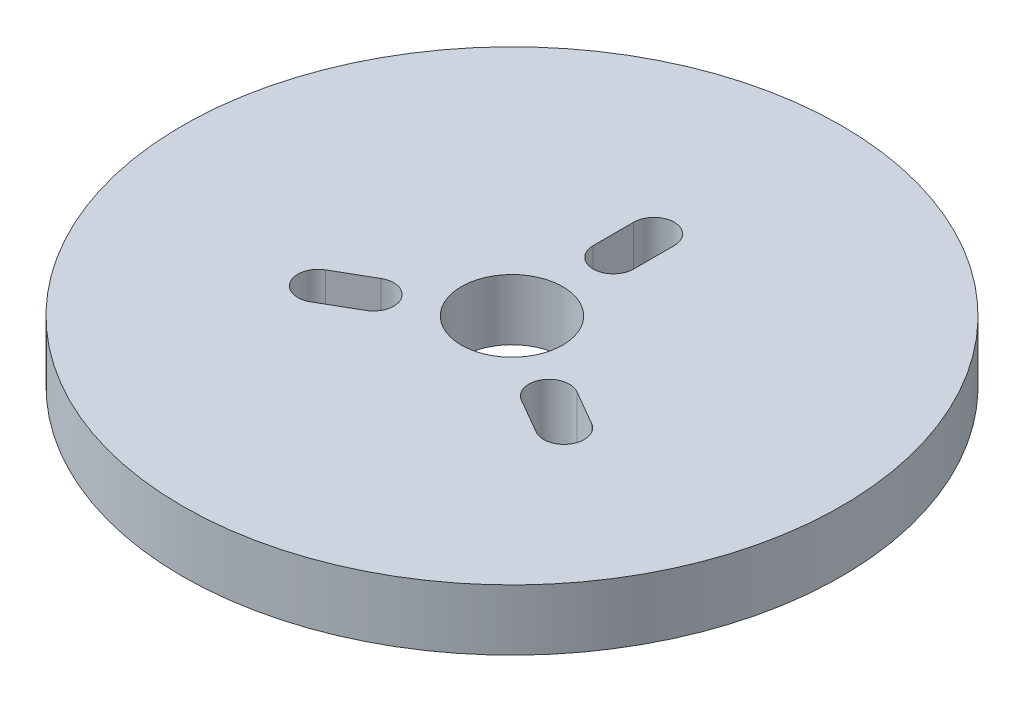
ISO-10303-21;
HEADER;
FILE_DESCRIPTION(('STEP AP214'),'2;1');
FILE_NAME('part.step','',(''),(''),'','','');
FILE_SCHEMA(('AUTOMOTIVE_DESIGN { 1 0 10303 214 1 1 1 1 }'));
ENDSEC;
DATA;
#1=APPLICATION_CONTEXT('core data for automotive mechanical design processes');
#2=APPLICATION_PROTOCOL_DEFINITION('international standard','automotive_design',2000,#1);
#3=PRODUCT_CONTEXT('',#1,'mechanical');
#4=PRODUCT('Part','Part','',(#3));
#5=PRODUCT_RELATED_PRODUCT_CATEGORY('part','',(#4));
#6=PRODUCT_DEFINITION_FORMATION('','',#4);
#7=PRODUCT_DEFINITION_CONTEXT('part definition',#1,'design');
#8=PRODUCT_DEFINITION('design','',#6,#7);
#9=PRODUCT_DEFINITION_SHAPE('','',#8);
#10=(LENGTH_UNIT() NAMED_UNIT(*) SI_UNIT(.MILLI.,.METRE.));
#11=(NAMED_UNIT(*) PLANE_ANGLE_UNIT() SI_UNIT($,.RADIAN.));
#12=(NAMED_UNIT(*) SI_UNIT($,.STERADIAN.) SOLID_ANGLE_UNIT());
#13=UNCERTAINTY_MEASURE_WITH_UNIT(LENGTH_MEASURE(1.E-05),#10,'distance_accuracy_value','');
#14=(GEOMETRIC_REPRESENTATION_CONTEXT(3) GLOBAL_UNCERTAINTY_ASSIGNED_CONTEXT((#13)) GLOBAL_UNIT_ASSIGNED_CONTEXT((#10,
#11,#12)) REPRESENTATION_CONTEXT('',''));
#15=CARTESIAN_POINT('',(0.,0.,0.));
#16=DIRECTION('',(0.,0.,1.));
#17=DIRECTION('',(1.,0.,0.));
#18=AXIS2_PLACEMENT_3D('',#15,#16,#17);
#19=CARTESIAN_POINT('',(0.,6.,0.));
#20=DIRECTION('',(0.,1.,0.));
#21=DIRECTION('',(0.,0.,1.));
#22=AXIS2_PLACEMENT_3D('',#19,#20,#21);
#23=PLANE('',#22);
#24=CARTESIAN_POINT('',(0.,6.,0.));
#25=DIRECTION('',(0.,1.,0.));
#26=DIRECTION('',(0.,0.,1.));
#27=AXIS2_PLACEMENT_3D('',#24,#25,#26);
#28=CIRCLE('',#27,32.5);
#29=CARTESIAN_POINT('',(0.,6.,32.5));
#30=VERTEX_POINT('',#29);
#31=EDGE_CURVE('E11',#30,#30,#28,.T.);
#32=ORIENTED_EDGE('',*,*,#31,.T.);
#33=EDGE_LOOP('',(#32));
#34=FACE_BOUND('',#33,.T.);
#35=CARTESIAN_POINT('',(0.,6.,0.));
#36=DIRECTION('',(0.,1.,0.));
#37=DIRECTION('',(0.,0.,1.));
#38=AXIS2_PLACEMENT_3D('',#35,#36,#37);
#39=CIRCLE('',#38,5.);
#40=CARTESIAN_POINT('',(0.,6.,5.));
#41=VERTEX_POINT('',#40);
#42=EDGE_CURVE('E222',#41,#41,#39,.T.);
#43=ORIENTED_EDGE('',*,*,#42,.F.);
#44=EDGE_LOOP('',(#43));
#45=FACE_BOUND('',#44,.T.);
#46=DIRECTION('',(0.,0.,-1.));
#47=VECTOR('',#46,1.);
#48=CARTESIAN_POINT('',(2.,6.,-10.));
#49=LINE('',#48,#47);
#50=CARTESIAN_POINT('',(2.,6.,-10.));
#51=VERTEX_POINT('',#50);
#52=CARTESIAN_POINT('',(2.,6.,-14.));
#53=VERTEX_POINT('',#52);
#54=EDGE_CURVE('E193',#51,#53,#49,.T.);
#55=ORIENTED_EDGE('',*,*,#54,.F.);
#56=CARTESIAN_POINT('',(0.,6.,-10.));
#57=DIRECTION('',(0.,1.,0.));
#58=DIRECTION('',(0.,0.,1.));
#59=AXIS2_PLACEMENT_3D('',#56,#57,#58);
#60=CIRCLE('',#59,2.);
#61=CARTESIAN_POINT('',(-2.,6.,-10.));
#62=VERTEX_POINT('',#61);
#63=EDGE_CURVE('E191',#62,#51,#60,.T.);
#64=ORIENTED_EDGE('',*,*,#63,.F.);
#65=DIRECTION('',(0.,0.,1.));
#66=VECTOR('',#65,1.);
#67=CARTESIAN_POINT('',(-2.,6.,-10.));
#68=LINE('',#67,#66);
#69=CARTESIAN_POINT('',(-2.,6.,-14.));
#70=VERTEX_POINT('',#69);
#71=EDGE_CURVE('E199',#70,#62,#68,.T.);
#72=ORIENTED_EDGE('',*,*,#71,.F.);
#73=CARTESIAN_POINT('',(0.,6.,-14.));
#74=DIRECTION('',(0.,1.,0.));
#75=DIRECTION('',(0.,0.,1.));
#76=AXIS2_PLACEMENT_3D('',#73,#74,#75);
#77=CIRCLE('',#76,2.);
#78=EDGE_CURVE('E196',#53,#70,#77,.T.);
#79=ORIENTED_EDGE('',*,*,#78,.F.);
#80=EDGE_LOOP('',(#55,#64,#72,#79));
#81=FACE_BOUND('',#80,.T.);
#82=DIRECTION('',(0.866025403784439,0.,0.5));
#83=VECTOR('',#82,1.);
#84=CARTESIAN_POINT('',(7.66025403784503,6.,6.73205080756851));
#85=LINE('',#84,#83);
#86=CARTESIAN_POINT('',(7.66025403784503,6.,6.73205080756851));
#87=VERTEX_POINT('',#86);
#88=CARTESIAN_POINT('',(11.1243556529828,6.,8.73205080756851));
#89=VERTEX_POINT('',#88);
#90=EDGE_CURVE('E162',#87,#89,#85,.T.);
#91=ORIENTED_EDGE('',*,*,#90,.F.);
#92=CARTESIAN_POINT('',(8.66025403784503,6.,4.99999999999963));
#93=DIRECTION('',(0.,1.,0.));
#94=DIRECTION('',(0.,0.,1.));
#95=AXIS2_PLACEMENT_3D('',#92,#93,#94);
#96=CIRCLE('',#95,2.);
#97=CARTESIAN_POINT('',(9.66025403784502,6.,3.26794919243075));
#98=VERTEX_POINT('',#97);
#99=EDGE_CURVE('E160',#98,#87,#96,.T.);
#100=ORIENTED_EDGE('',*,*,#99,.F.);
#101=DIRECTION('',(-0.866025403784439,0.,-0.5));
#102=VECTOR('',#101,1.);
#103=CARTESIAN_POINT('',(9.66025403784502,6.,3.26794919243075));
#104=LINE('',#103,#102);
#105=CARTESIAN_POINT('',(13.1243556529828,6.,5.26794919243075));
#106=VERTEX_POINT('',#105);
#107=EDGE_CURVE('E168',#106,#98,#104,.T.);
#108=ORIENTED_EDGE('',*,*,#107,.F.);
#109=CARTESIAN_POINT('',(12.1243556529828,6.,6.99999999999963));
#110=DIRECTION('',(0.,1.,0.));
#111=DIRECTION('',(0.,0.,1.));
#112=AXIS2_PLACEMENT_3D('',#109,#110,#111);
#113=CIRCLE('',#112,2.);
#114=EDGE_CURVE('E165',#89,#106,#113,.T.);
#115=ORIENTED_EDGE('',*,*,#114,.F.);
#116=EDGE_LOOP('',(#91,#100,#108,#115));
#117=FACE_BOUND('',#116,.T.);
#118=DIRECTION('',(-0.866025403784439,0.,0.499999999999999));
#119=VECTOR('',#118,1.);
#120=CARTESIAN_POINT('',(-9.66025403784375,6.,3.26794919243149));
#121=LINE('',#120,#119);
#122=CARTESIAN_POINT('',(-9.66025403784375,6.,3.26794919243149));
#123=VERTEX_POINT('',#122);
#124=CARTESIAN_POINT('',(-13.1243556529815,6.,5.26794919243149));
#125=VERTEX_POINT('',#124);
#126=EDGE_CURVE('E132',#123,#125,#121,.T.);
#127=ORIENTED_EDGE('',*,*,#126,.F.);
#128=CARTESIAN_POINT('',(-8.66025403784375,6.,5.00000000000037));
#129=DIRECTION('',(0.,1.,0.));
#130=DIRECTION('',(0.,0.,1.));
#131=AXIS2_PLACEMENT_3D('',#128,#129,#130);
#132=CIRCLE('',#131,2.);
#133=CARTESIAN_POINT('',(-7.66025403784375,6.,6.73205080756924));
#134=VERTEX_POINT('',#133);
#135=EDGE_CURVE('E124',#134,#123,#132,.T.);
#136=ORIENTED_EDGE('',*,*,#135,.F.);
#137=DIRECTION('',(0.866025403784439,0.,-0.5));
#138=VECTOR('',#137,1.);
#139=CARTESIAN_POINT('',(-7.66025403784375,6.,6.73205080756924));
#140=LINE('',#139,#138);
#141=CARTESIAN_POINT('',(-11.1243556529815,6.,8.73205080756924));
#142=VERTEX_POINT('',#141);
#143=EDGE_CURVE('E146',#142,#134,#140,.T.);
#144=ORIENTED_EDGE('',*,*,#143,.F.);
#145=CARTESIAN_POINT('',(-12.1243556529815,6.,7.00000000000037));
#146=DIRECTION('',(0.,1.,0.));
#147=DIRECTION('',(0.,0.,1.));
#148=AXIS2_PLACEMENT_3D('',#145,#146,#147);
#149=CIRCLE('',#148,2.);
#150=EDGE_CURVE('E144',#125,#142,#149,.T.);
#151=ORIENTED_EDGE('',*,*,#150,.F.);
#152=EDGE_LOOP('',(#127,#136,#144,#151));
#153=FACE_BOUND('',#152,.T.);
#154=ADVANCED_FACE('F35',(#34,#45,#81,#117,#153),#23,.T.);
#155=CARTESIAN_POINT('',(0.,0.,0.));
#156=DIRECTION('',(0.,1.,0.));
#157=DIRECTION('',(0.,0.,1.));
#158=AXIS2_PLACEMENT_3D('',#155,#156,#157);
#159=PLANE('',#158);
#160=CARTESIAN_POINT('',(8.66025403784503,0.,4.99999999999963));
#161=DIRECTION('',(0.,1.,0.));
#162=DIRECTION('',(0.,0.,1.));
#163=AXIS2_PLACEMENT_3D('',#160,#161,#162);
#164=CIRCLE('',#163,2.);
#165=CARTESIAN_POINT('',(9.66025403784502,0.,3.26794919243075));
#166=VERTEX_POINT('',#165);
#167=CARTESIAN_POINT('',(7.66025403784503,0.,6.73205080756851));
#168=VERTEX_POINT('',#167);
#169=EDGE_CURVE('E140',#166,#168,#164,.T.);
#170=ORIENTED_EDGE('',*,*,#169,.T.);
#171=DIRECTION('',(0.866025403784439,0.,0.5));
#172=VECTOR('',#171,1.);
#173=CARTESIAN_POINT('',(7.66025403784503,0.,6.73205080756851));
#174=LINE('',#173,#172);
#175=CARTESIAN_POINT('',(11.1243556529828,0.,8.73205080756851));
#176=VERTEX_POINT('',#175);
#177=EDGE_CURVE('E173',#168,#176,#174,.T.);
#178=ORIENTED_EDGE('',*,*,#177,.T.);
#179=CARTESIAN_POINT('',(12.1243556529828,0.,6.99999999999963));
#180=DIRECTION('',(0.,1.,0.));
#181=DIRECTION('',(0.,0.,1.));
#182=AXIS2_PLACEMENT_3D('',#179,#180,#181);
#183=CIRCLE('',#182,2.);
#184=CARTESIAN_POINT('',(13.1243556529828,0.,5.26794919243075));
#185=VERTEX_POINT('',#184);
#186=EDGE_CURVE('E176',#176,#185,#183,.T.);
#187=ORIENTED_EDGE('',*,*,#186,.T.);
#188=DIRECTION('',(-0.866025403784439,0.,-0.5));
#189=VECTOR('',#188,1.);
#190=CARTESIAN_POINT('',(9.66025403784502,0.,3.26794919243075));
#191=LINE('',#190,#189);
#192=EDGE_CURVE('E163',#185,#166,#191,.T.);
#193=ORIENTED_EDGE('',*,*,#192,.T.);
#194=EDGE_LOOP('',(#170,#178,#187,#193));
#195=FACE_BOUND('',#194,.T.);
#196=CARTESIAN_POINT('',(0.,0.,0.));
#197=DIRECTION('',(0.,1.,0.));
#198=DIRECTION('',(0.,0.,1.));
#199=AXIS2_PLACEMENT_3D('',#196,#197,#198);
#200=CIRCLE('',#199,5.);
#201=CARTESIAN_POINT('',(0.,0.,5.));
#202=VERTEX_POINT('',#201);
#203=EDGE_CURVE('E221',#202,#202,#200,.T.);
#204=ORIENTED_EDGE('',*,*,#203,.T.);
#205=EDGE_LOOP('',(#204));
#206=FACE_BOUND('',#205,.T.);
#207=CARTESIAN_POINT('',(0.,0.,0.));
#208=DIRECTION('',(0.,1.,0.));
#209=DIRECTION('',(0.,0.,1.));
#210=AXIS2_PLACEMENT_3D('',#207,#208,#209);
#211=CIRCLE('',#210,32.5);
#212=CARTESIAN_POINT('',(0.,0.,32.5));
#213=VERTEX_POINT('',#212);
#214=EDGE_CURVE('E39',#213,#213,#211,.T.);
#215=ORIENTED_EDGE('',*,*,#214,.F.);
#216=EDGE_LOOP('',(#215));
#217=FACE_BOUND('',#216,.T.);
#218=CARTESIAN_POINT('',(0.,0.,-10.));
#219=DIRECTION('',(0.,1.,0.));
#220=DIRECTION('',(0.,0.,1.));
#221=AXIS2_PLACEMENT_3D('',#218,#219,#220);
#222=CIRCLE('',#221,2.);
#223=CARTESIAN_POINT('',(-2.,0.,-10.));
#224=VERTEX_POINT('',#223);
#225=CARTESIAN_POINT('',(2.,0.,-10.));
#226=VERTEX_POINT('',#225);
#227=EDGE_CURVE('E190',#224,#226,#222,.T.);
#228=ORIENTED_EDGE('',*,*,#227,.T.);
#229=DIRECTION('',(0.,0.,-1.));
#230=VECTOR('',#229,1.);
#231=CARTESIAN_POINT('',(2.,0.,-10.));
#232=LINE('',#231,#230);
#233=CARTESIAN_POINT('',(2.,0.,-14.));
#234=VERTEX_POINT('',#233);
#235=EDGE_CURVE('E204',#226,#234,#232,.T.);
#236=ORIENTED_EDGE('',*,*,#235,.T.);
#237=CARTESIAN_POINT('',(0.,0.,-14.));
#238=DIRECTION('',(0.,1.,0.));
#239=DIRECTION('',(0.,0.,1.));
#240=AXIS2_PLACEMENT_3D('',#237,#238,#239);
#241=CIRCLE('',#240,2.);
#242=CARTESIAN_POINT('',(-2.,0.,-14.));
#243=VERTEX_POINT('',#242);
#244=EDGE_CURVE('E207',#234,#243,#241,.T.);
#245=ORIENTED_EDGE('',*,*,#244,.T.);
#246=DIRECTION('',(0.,0.,1.));
#247=VECTOR('',#246,1.);
#248=CARTESIAN_POINT('',(-2.,0.,-10.));
#249=LINE('',#248,#247);
#250=EDGE_CURVE('E194',#243,#224,#249,.T.);
#251=ORIENTED_EDGE('',*,*,#250,.T.);
#252=EDGE_LOOP('',(#228,#236,#245,#251));
#253=FACE_BOUND('',#252,.T.);
#254=CARTESIAN_POINT('',(-8.66025403784375,0.,5.00000000000037));
#255=DIRECTION('',(0.,1.,0.));
#256=DIRECTION('',(0.,0.,1.));
#257=AXIS2_PLACEMENT_3D('',#254,#255,#256);
#258=CIRCLE('',#257,2.);
#259=CARTESIAN_POINT('',(-7.66025403784375,0.,6.73205080756924));
#260=VERTEX_POINT('',#259);
#261=CARTESIAN_POINT('',(-9.66025403784375,0.,3.26794919243149));
#262=VERTEX_POINT('',#261);
#263=EDGE_CURVE('E58',#260,#262,#258,.T.);
#264=ORIENTED_EDGE('',*,*,#263,.T.);
#265=DIRECTION('',(-0.866025403784439,0.,0.499999999999999));
#266=VECTOR('',#265,1.);
#267=CARTESIAN_POINT('',(-9.66025403784375,0.,3.26794919243149));
#268=LINE('',#267,#266);
#269=CARTESIAN_POINT('',(-13.1243556529815,0.,5.26794919243149));
#270=VERTEX_POINT('',#269);
#271=EDGE_CURVE('E139',#262,#270,#268,.T.);
#272=ORIENTED_EDGE('',*,*,#271,.T.);
#273=CARTESIAN_POINT('',(-12.1243556529815,0.,7.00000000000037));
#274=DIRECTION('',(0.,1.,0.));
#275=DIRECTION('',(0.,0.,1.));
#276=AXIS2_PLACEMENT_3D('',#273,#274,#275);
#277=CIRCLE('',#276,2.);
#278=CARTESIAN_POINT('',(-11.1243556529815,0.,8.73205080756924));
#279=VERTEX_POINT('',#278);
#280=EDGE_CURVE('E152',#270,#279,#277,.T.);
#281=ORIENTED_EDGE('',*,*,#280,.T.);
#282=DIRECTION('',(0.866025403784439,0.,-0.5));
#283=VECTOR('',#282,1.);
#284=CARTESIAN_POINT('',(-7.66025403784375,0.,6.73205080756924));
#285=LINE('',#284,#283);
#286=EDGE_CURVE('E133',#279,#260,#285,.T.);
#287=ORIENTED_EDGE('',*,*,#286,.T.);
#288=EDGE_LOOP('',(#264,#272,#281,#287));
#289=FACE_BOUND('',#288,.T.);
#290=ADVANCED_FACE('F228',(#195,#206,#217,#253,#289),#159,.F.);
#291=CARTESIAN_POINT('',(0.,6.,0.));
#292=DIRECTION('',(0.,-1.,0.));
#293=DIRECTION('',(0.,0.,-1.));
#294=AXIS2_PLACEMENT_3D('',#291,#292,#293);
#295=CYLINDRICAL_SURFACE('',#294,32.5);
#296=ORIENTED_EDGE('',*,*,#31,.F.);
#297=EDGE_LOOP('',(#296));
#298=FACE_BOUND('',#297,.T.);
#299=ORIENTED_EDGE('',*,*,#214,.T.);
#300=EDGE_LOOP('',(#299));
#301=FACE_BOUND('',#300,.T.);
#302=ADVANCED_FACE('F37',(#298,#301),#295,.T.);
#303=CARTESIAN_POINT('',(0.,6.,0.));
#304=DIRECTION('',(0.,-1.,0.));
#305=DIRECTION('',(0.,0.,-1.));
#306=AXIS2_PLACEMENT_3D('',#303,#304,#305);
#307=CYLINDRICAL_SURFACE('',#306,5.);
#308=ORIENTED_EDGE('',*,*,#42,.T.);
#309=EDGE_LOOP('',(#308));
#310=FACE_BOUND('',#309,.T.);
#311=ORIENTED_EDGE('',*,*,#203,.F.);
#312=EDGE_LOOP('',(#311));
#313=FACE_BOUND('',#312,.T.);
#314=ADVANCED_FACE('F231',(#310,#313),#307,.F.);
#315=CARTESIAN_POINT('',(0.,6.,-10.));
#316=DIRECTION('',(0.,-1.,0.));
#317=DIRECTION('',(0.,0.,-1.));
#318=AXIS2_PLACEMENT_3D('',#315,#316,#317);
#319=CYLINDRICAL_SURFACE('',#318,2.);
#320=ORIENTED_EDGE('',*,*,#227,.F.);
#321=DIRECTION('',(0.,-1.,0.));
#322=VECTOR('',#321,1.);
#323=CARTESIAN_POINT('',(-2.,6.,-10.));
#324=LINE('',#323,#322);
#325=EDGE_CURVE('E201',#62,#224,#324,.T.);
#326=ORIENTED_EDGE('',*,*,#325,.F.);
#327=ORIENTED_EDGE('',*,*,#63,.T.);
#328=DIRECTION('',(0.,-1.,0.));
#329=VECTOR('',#328,1.);
#330=CARTESIAN_POINT('',(2.,6.,-10.));
#331=LINE('',#330,#329);
#332=EDGE_CURVE('E218',#51,#226,#331,.T.);
#333=ORIENTED_EDGE('',*,*,#332,.T.);
#334=EDGE_LOOP('',(#320,#326,#327,#333));
#335=FACE_BOUND('',#334,.T.);
#336=ADVANCED_FACE('F233',(#335),#319,.F.);
#337=CARTESIAN_POINT('',(2.,6.,-10.));
#338=DIRECTION('',(-1.,0.,0.));
#339=DIRECTION('',(0.,0.,1.));
#340=AXIS2_PLACEMENT_3D('',#337,#338,#339);
#341=PLANE('',#340);
#342=ORIENTED_EDGE('',*,*,#235,.F.);
#343=ORIENTED_EDGE('',*,*,#332,.F.);
#344=ORIENTED_EDGE('',*,*,#54,.T.);
#345=DIRECTION('',(0.,-1.,0.));
#346=VECTOR('',#345,1.);
#347=CARTESIAN_POINT('',(2.,6.,-14.));
#348=LINE('',#347,#346);
#349=EDGE_CURVE('E216',#53,#234,#348,.T.);
#350=ORIENTED_EDGE('',*,*,#349,.T.);
#351=EDGE_LOOP('',(#342,#343,#344,#350));
#352=FACE_BOUND('',#351,.T.);
#353=ADVANCED_FACE('F240',(#352),#341,.T.);
#354=CARTESIAN_POINT('',(0.,6.,-14.));
#355=DIRECTION('',(0.,-1.,0.));
#356=DIRECTION('',(0.,0.,-1.));
#357=AXIS2_PLACEMENT_3D('',#354,#355,#356);
#358=CYLINDRICAL_SURFACE('',#357,2.);
#359=ORIENTED_EDGE('',*,*,#244,.F.);
#360=ORIENTED_EDGE('',*,*,#349,.F.);
#361=ORIENTED_EDGE('',*,*,#78,.T.);
#362=DIRECTION('',(0.,-1.,0.));
#363=VECTOR('',#362,1.);
#364=CARTESIAN_POINT('',(-2.,6.,-14.));
#365=LINE('',#364,#363);
#366=EDGE_CURVE('E214',#70,#243,#365,.T.);
#367=ORIENTED_EDGE('',*,*,#366,.T.);
#368=EDGE_LOOP('',(#359,#360,#361,#367));
#369=FACE_BOUND('',#368,.T.);
#370=ADVANCED_FACE('F293',(#369),#358,.F.);
#371=CARTESIAN_POINT('',(-2.,6.,-10.));
#372=DIRECTION('',(1.,0.,0.));
#373=DIRECTION('',(0.,0.,-1.));
#374=AXIS2_PLACEMENT_3D('',#371,#372,#373);
#375=PLANE('',#374);
#376=ORIENTED_EDGE('',*,*,#250,.F.);
#377=ORIENTED_EDGE('',*,*,#366,.F.);
#378=ORIENTED_EDGE('',*,*,#71,.T.);
#379=ORIENTED_EDGE('',*,*,#325,.T.);
#380=EDGE_LOOP('',(#376,#377,#378,#379));
#381=FACE_BOUND('',#380,.T.);
#382=ADVANCED_FACE('F290',(#381),#375,.T.);
#383=CARTESIAN_POINT('',(8.66025403784503,6.,4.99999999999963));
#384=DIRECTION('',(0.,-1.,0.));
#385=DIRECTION('',(0.,0.,-1.));
#386=AXIS2_PLACEMENT_3D('',#383,#384,#385);
#387=CYLINDRICAL_SURFACE('',#386,2.);
#388=ORIENTED_EDGE('',*,*,#169,.F.);
#389=DIRECTION('',(0.,-1.,0.));
#390=VECTOR('',#389,1.);
#391=CARTESIAN_POINT('',(9.66025403784502,6.,3.26794919243075));
#392=LINE('',#391,#390);
#393=EDGE_CURVE('E170',#98,#166,#392,.T.);
#394=ORIENTED_EDGE('',*,*,#393,.F.);
#395=ORIENTED_EDGE('',*,*,#99,.T.);
#396=DIRECTION('',(0.,-1.,0.));
#397=VECTOR('',#396,1.);
#398=CARTESIAN_POINT('',(7.66025403784503,6.,6.73205080756851));
#399=LINE('',#398,#397);
#400=EDGE_CURVE('E187',#87,#168,#399,.T.);
#401=ORIENTED_EDGE('',*,*,#400,.T.);
#402=EDGE_LOOP('',(#388,#394,#395,#401));
#403=FACE_BOUND('',#402,.T.);
#404=ADVANCED_FACE('F272',(#403),#387,.F.);
#405=CARTESIAN_POINT('',(7.66025403784503,6.,6.73205080756851));
#406=DIRECTION('',(0.5,0.,-0.866025403784439));
#407=DIRECTION('',(-0.866025403784439,0.,-0.5));
#408=AXIS2_PLACEMENT_3D('',#405,#406,#407);
#409=PLANE('',#408);
#410=ORIENTED_EDGE('',*,*,#177,.F.);
#411=ORIENTED_EDGE('',*,*,#400,.F.);
#412=ORIENTED_EDGE('',*,*,#90,.T.);
#413=DIRECTION('',(0.,-1.,0.));
#414=VECTOR('',#413,1.);
#415=CARTESIAN_POINT('',(11.1243556529828,6.,8.73205080756851));
#416=LINE('',#415,#414);
#417=EDGE_CURVE('E185',#89,#176,#416,.T.);
#418=ORIENTED_EDGE('',*,*,#417,.T.);
#419=EDGE_LOOP('',(#410,#411,#412,#418));
#420=FACE_BOUND('',#419,.T.);
#421=ADVANCED_FACE('F266',(#420),#409,.T.);
#422=CARTESIAN_POINT('',(12.1243556529828,6.,6.99999999999963));
#423=DIRECTION('',(0.,-1.,0.));
#424=DIRECTION('',(0.,0.,-1.));
#425=AXIS2_PLACEMENT_3D('',#422,#423,#424);
#426=CYLINDRICAL_SURFACE('',#425,2.);
#427=ORIENTED_EDGE('',*,*,#186,.F.);
#428=ORIENTED_EDGE('',*,*,#417,.F.);
#429=ORIENTED_EDGE('',*,*,#114,.T.);
#430=DIRECTION('',(0.,-1.,0.));
#431=VECTOR('',#430,1.);
#432=CARTESIAN_POINT('',(13.1243556529828,6.,5.26794919243075));
#433=LINE('',#432,#431);
#434=EDGE_CURVE('E183',#106,#185,#433,.T.);
#435=ORIENTED_EDGE('',*,*,#434,.T.);
#436=EDGE_LOOP('',(#427,#428,#429,#435));
#437=FACE_BOUND('',#436,.T.);
#438=ADVANCED_FACE('F269',(#437),#426,.F.);
#439=CARTESIAN_POINT('',(9.66025403784502,6.,3.26794919243075));
#440=DIRECTION('',(-0.5,0.,0.866025403784439));
#441=DIRECTION('',(0.866025403784439,0.,0.5));
#442=AXIS2_PLACEMENT_3D('',#439,#440,#441);
#443=PLANE('',#442);
#444=ORIENTED_EDGE('',*,*,#192,.F.);
#445=ORIENTED_EDGE('',*,*,#434,.F.);
#446=ORIENTED_EDGE('',*,*,#107,.T.);
#447=ORIENTED_EDGE('',*,*,#393,.T.);
#448=EDGE_LOOP('',(#444,#445,#446,#447));
#449=FACE_BOUND('',#448,.T.);
#450=ADVANCED_FACE('F275',(#449),#443,.T.);
#451=CARTESIAN_POINT('',(-8.66025403784375,6.,5.00000000000037));
#452=DIRECTION('',(0.,-1.,0.));
#453=DIRECTION('',(0.,0.,-1.));
#454=AXIS2_PLACEMENT_3D('',#451,#452,#453);
#455=CYLINDRICAL_SURFACE('',#454,2.);
#456=ORIENTED_EDGE('',*,*,#263,.F.);
#457=DIRECTION('',(0.,-1.,0.));
#458=VECTOR('',#457,1.);
#459=CARTESIAN_POINT('',(-7.66025403784375,6.,6.73205080756924));
#460=LINE('',#459,#458);
#461=EDGE_CURVE('E128',#134,#260,#460,.T.);
#462=ORIENTED_EDGE('',*,*,#461,.F.);
#463=ORIENTED_EDGE('',*,*,#135,.T.);
#464=DIRECTION('',(0.,-1.,0.));
#465=VECTOR('',#464,1.);
#466=CARTESIAN_POINT('',(-9.66025403784375,6.,3.26794919243149));
#467=LINE('',#466,#465);
#468=EDGE_CURVE('E127',#123,#262,#467,.T.);
#469=ORIENTED_EDGE('',*,*,#468,.T.);
#470=EDGE_LOOP('',(#456,#462,#463,#469));
#471=FACE_BOUND('',#470,.T.);
#472=ADVANCED_FACE('F126',(#471),#455,.F.);
#473=CARTESIAN_POINT('',(-9.66025403784375,6.,3.26794919243149));
#474=DIRECTION('',(0.499999999999999,0.,0.866025403784439));
#475=DIRECTION('',(0.866025403784439,0.,-0.499999999999999));
#476=AXIS2_PLACEMENT_3D('',#473,#474,#475);
#477=PLANE('',#476);
#478=ORIENTED_EDGE('',*,*,#271,.F.);
#479=ORIENTED_EDGE('',*,*,#468,.F.);
#480=ORIENTED_EDGE('',*,*,#126,.T.);
#481=DIRECTION('',(0.,-1.,0.));
#482=VECTOR('',#481,1.);
#483=CARTESIAN_POINT('',(-13.1243556529815,6.,5.26794919243149));
#484=LINE('',#483,#482);
#485=EDGE_CURVE('E141',#125,#270,#484,.T.);
#486=ORIENTED_EDGE('',*,*,#485,.T.);
#487=EDGE_LOOP('',(#478,#479,#480,#486));
#488=FACE_BOUND('',#487,.T.);
#489=ADVANCED_FACE('F136',(#488),#477,.T.);
#490=CARTESIAN_POINT('',(-12.1243556529815,6.,7.00000000000037));
#491=DIRECTION('',(0.,-1.,0.));
#492=DIRECTION('',(0.,0.,-1.));
#493=AXIS2_PLACEMENT_3D('',#490,#491,#492);
#494=CYLINDRICAL_SURFACE('',#493,2.);
#495=ORIENTED_EDGE('',*,*,#280,.F.);
#496=ORIENTED_EDGE('',*,*,#485,.F.);
#497=ORIENTED_EDGE('',*,*,#150,.T.);
#498=DIRECTION('',(0.,-1.,0.));
#499=VECTOR('',#498,1.);
#500=CARTESIAN_POINT('',(-11.1243556529815,6.,8.73205080756924));
#501=LINE('',#500,#499);
#502=EDGE_CURVE('E50',#142,#279,#501,.T.);
#503=ORIENTED_EDGE('',*,*,#502,.T.);
#504=EDGE_LOOP('',(#495,#496,#497,#503));
#505=FACE_BOUND('',#504,.T.);
#506=ADVANCED_FACE('F313',(#505),#494,.F.);
#507=CARTESIAN_POINT('',(-7.66025403784375,6.,6.73205080756924));
#508=DIRECTION('',(-0.5,0.,-0.866025403784439));
#509=DIRECTION('',(-0.866025403784439,0.,0.5));
#510=AXIS2_PLACEMENT_3D('',#507,#508,#509);
#511=PLANE('',#510);
#512=ORIENTED_EDGE('',*,*,#286,.F.);
#513=ORIENTED_EDGE('',*,*,#502,.F.);
#514=ORIENTED_EDGE('',*,*,#143,.T.);
#515=ORIENTED_EDGE('',*,*,#461,.T.);
#516=EDGE_LOOP('',(#512,#513,#514,#515));
#517=FACE_BOUND('',#516,.T.);
#518=ADVANCED_FACE('F311',(#517),#511,.T.);
#519=CLOSED_SHELL('',(#154,#290,#302,#314,#336,#353,#370,#382,#404,#421,#438,#450,#472,#489,
#506,#518));
#520=MANIFOLD_SOLID_BREP('B2',#519);
#521=ADVANCED_BREP_SHAPE_REPRESENTATION('',(#18,#520),#14);
#522=SHAPE_DEFINITION_REPRESENTATION(#9,#521);
ENDSEC;
END-ISO-10303-21;
